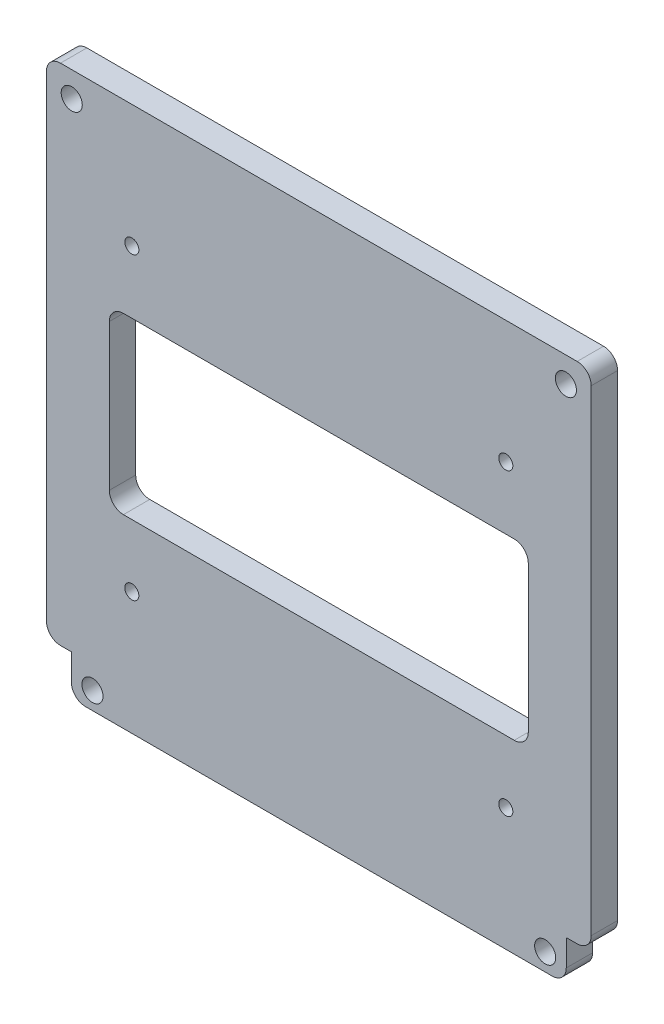
ISO-10303-21;
HEADER;
FILE_DESCRIPTION(('STEP AP214'),'2;1');
FILE_NAME('part.step','',(''),(''),'','','');
FILE_SCHEMA(('AUTOMOTIVE_DESIGN { 1 0 10303 214 1 1 1 1 }'));
ENDSEC;
DATA;
#1=APPLICATION_CONTEXT('core data for automotive mechanical design processes');
#2=APPLICATION_PROTOCOL_DEFINITION('international standard','automotive_design',2000,#1);
#3=PRODUCT_CONTEXT('',#1,'mechanical');
#4=PRODUCT('Part','Part','',(#3));
#5=PRODUCT_RELATED_PRODUCT_CATEGORY('part','',(#4));
#6=PRODUCT_DEFINITION_FORMATION('','',#4);
#7=PRODUCT_DEFINITION_CONTEXT('part definition',#1,'design');
#8=PRODUCT_DEFINITION('design','',#6,#7);
#9=PRODUCT_DEFINITION_SHAPE('','',#8);
#10=(LENGTH_UNIT() NAMED_UNIT(*) SI_UNIT(.MILLI.,.METRE.));
#11=(NAMED_UNIT(*) PLANE_ANGLE_UNIT() SI_UNIT($,.RADIAN.));
#12=(NAMED_UNIT(*) SI_UNIT($,.STERADIAN.) SOLID_ANGLE_UNIT());
#13=UNCERTAINTY_MEASURE_WITH_UNIT(LENGTH_MEASURE(1.E-05),#10,'distance_accuracy_value','');
#14=(GEOMETRIC_REPRESENTATION_CONTEXT(3) GLOBAL_UNCERTAINTY_ASSIGNED_CONTEXT((#13)) GLOBAL_UNIT_ASSIGNED_CONTEXT((#10,
#11,#12)) REPRESENTATION_CONTEXT('',''));
#15=CARTESIAN_POINT('',(0.,0.,0.));
#16=DIRECTION('',(0.,0.,1.));
#17=DIRECTION('',(1.,0.,0.));
#18=AXIS2_PLACEMENT_3D('',#15,#16,#17);
#19=CARTESIAN_POINT('',(10.6529359953024,78.0317307692308,4.7625));
#20=DIRECTION('',(-1.,0.,0.));
#21=DIRECTION('',(0.,-1.,0.));
#22=AXIS2_PLACEMENT_3D('',#19,#20,#21);
#23=PLANE('',#22);
#24=DIRECTION('',(0.,1.,0.));
#25=VECTOR('',#24,1.);
#26=CARTESIAN_POINT('',(10.6529359953024,78.0317307692308,4.7625));
#27=LINE('',#26,#25);
#28=CARTESIAN_POINT('',(10.6529359953024,-10.5507692307691,4.7625));
#29=VERTEX_POINT('',#28);
#30=CARTESIAN_POINT('',(10.6529359953024,75.4917307692308,4.7625));
#31=VERTEX_POINT('',#30);
#32=EDGE_CURVE('E306',#29,#31,#27,.T.);
#33=ORIENTED_EDGE('',*,*,#32,.F.);
#34=DIRECTION('',(0.,0.,-1.));
#35=VECTOR('',#34,1.);
#36=CARTESIAN_POINT('',(10.6529359953024,-10.5507692307691,4.7625));
#37=LINE('',#36,#35);
#38=CARTESIAN_POINT('',(10.6529359953024,-10.5507692307691,0.));
#39=VERTEX_POINT('',#38);
#40=EDGE_CURVE('E45',#29,#39,#37,.T.);
#41=ORIENTED_EDGE('',*,*,#40,.T.);
#42=DIRECTION('',(0.,1.,0.));
#43=VECTOR('',#42,1.);
#44=CARTESIAN_POINT('',(10.6529359953024,78.0317307692308,0.));
#45=LINE('',#44,#43);
#46=CARTESIAN_POINT('',(10.6529359953024,75.4917307692308,0.));
#47=VERTEX_POINT('',#46);
#48=EDGE_CURVE('E303',#39,#47,#45,.T.);
#49=ORIENTED_EDGE('',*,*,#48,.T.);
#50=DIRECTION('',(0.,0.,-1.));
#51=VECTOR('',#50,1.);
#52=CARTESIAN_POINT('',(10.6529359953024,75.4917307692308,4.7625));
#53=LINE('',#52,#51);
#54=EDGE_CURVE('E326',#47,#31,#53,.F.);
#55=ORIENTED_EDGE('',*,*,#54,.T.);
#56=EDGE_LOOP('',(#33,#41,#49,#55));
#57=FACE_BOUND('',#56,.T.);
#58=ADVANCED_FACE('F37',(#57),#23,.F.);
#59=CARTESIAN_POINT('',(-87.7720640046976,78.0317307692308,4.7625));
#60=DIRECTION('',(0.,-1.,0.));
#61=DIRECTION('',(0.,0.,-1.));
#62=AXIS2_PLACEMENT_3D('',#59,#60,#61);
#63=PLANE('',#62);
#64=DIRECTION('',(-1.,0.,0.));
#65=VECTOR('',#64,1.);
#66=CARTESIAN_POINT('',(-87.7720640046976,78.0317307692308,0.));
#67=LINE('',#66,#65);
#68=CARTESIAN_POINT('',(8.11293599530241,78.0317307692308,0.));
#69=VERTEX_POINT('',#68);
#70=CARTESIAN_POINT('',(-85.2320640046976,78.0317307692308,0.));
#71=VERTEX_POINT('',#70);
#72=EDGE_CURVE('E367',#69,#71,#67,.T.);
#73=ORIENTED_EDGE('',*,*,#72,.T.);
#74=DIRECTION('',(0.,0.,-1.));
#75=VECTOR('',#74,1.);
#76=CARTESIAN_POINT('',(-85.2320640046976,78.0317307692308,4.7625));
#77=LINE('',#76,#75);
#78=CARTESIAN_POINT('',(-85.2320640046976,78.0317307692308,4.7625));
#79=VERTEX_POINT('',#78);
#80=EDGE_CURVE('E322',#71,#79,#77,.F.);
#81=ORIENTED_EDGE('',*,*,#80,.T.);
#82=DIRECTION('',(-1.,0.,0.));
#83=VECTOR('',#82,1.);
#84=CARTESIAN_POINT('',(-87.7720640046976,78.0317307692308,4.7625));
#85=LINE('',#84,#83);
#86=CARTESIAN_POINT('',(8.11293599530241,78.0317307692308,4.7625));
#87=VERTEX_POINT('',#86);
#88=EDGE_CURVE('E309',#87,#79,#85,.T.);
#89=ORIENTED_EDGE('',*,*,#88,.F.);
#90=DIRECTION('',(0.,0.,-1.));
#91=VECTOR('',#90,1.);
#92=CARTESIAN_POINT('',(8.11293599530241,78.0317307692308,4.7625));
#93=LINE('',#92,#91);
#94=EDGE_CURVE('E382',#87,#69,#93,.T.);
#95=ORIENTED_EDGE('',*,*,#94,.T.);
#96=EDGE_LOOP('',(#73,#81,#89,#95));
#97=FACE_BOUND('',#96,.T.);
#98=ADVANCED_FACE('F386',(#97),#63,.F.);
#99=CARTESIAN_POINT('',(-87.7720640046976,78.0317307692308,4.7625));
#100=DIRECTION('',(1.,0.,0.));
#101=DIRECTION('',(0.,1.,0.));
#102=AXIS2_PLACEMENT_3D('',#99,#100,#101);
#103=PLANE('',#102);
#104=DIRECTION('',(0.,-1.,0.));
#105=VECTOR('',#104,1.);
#106=CARTESIAN_POINT('',(-87.7720640046976,78.0317307692308,0.));
#107=LINE('',#106,#105);
#108=CARTESIAN_POINT('',(-87.7720640046976,75.4917307692308,0.));
#109=VERTEX_POINT('',#108);
#110=CARTESIAN_POINT('',(-87.7720640046976,-10.5507692307691,0.));
#111=VERTEX_POINT('',#110);
#112=EDGE_CURVE('E369',#109,#111,#107,.T.);
#113=ORIENTED_EDGE('',*,*,#112,.T.);
#114=DIRECTION('',(0.,0.,-1.));
#115=VECTOR('',#114,1.);
#116=CARTESIAN_POINT('',(-87.7720640046976,-10.5507692307691,4.7625));
#117=LINE('',#116,#115);
#118=CARTESIAN_POINT('',(-87.7720640046976,-10.5507692307691,4.7625));
#119=VERTEX_POINT('',#118);
#120=EDGE_CURVE('E348',#111,#119,#117,.F.);
#121=ORIENTED_EDGE('',*,*,#120,.T.);
#122=DIRECTION('',(0.,-1.,0.));
#123=VECTOR('',#122,1.);
#124=CARTESIAN_POINT('',(-87.7720640046976,78.0317307692308,4.7625));
#125=LINE('',#124,#123);
#126=CARTESIAN_POINT('',(-87.7720640046976,75.4917307692308,4.7625));
#127=VERTEX_POINT('',#126);
#128=EDGE_CURVE('E330',#127,#119,#125,.T.);
#129=ORIENTED_EDGE('',*,*,#128,.F.);
#130=DIRECTION('',(0.,0.,-1.));
#131=VECTOR('',#130,1.);
#132=CARTESIAN_POINT('',(-87.7720640046976,75.4917307692308,4.7625));
#133=LINE('',#132,#131);
#134=EDGE_CURVE('E337',#127,#109,#133,.T.);
#135=ORIENTED_EDGE('',*,*,#134,.T.);
#136=EDGE_LOOP('',(#113,#121,#129,#135));
#137=FACE_BOUND('',#136,.T.);
#138=ADVANCED_FACE('F395',(#137),#103,.F.);
#139=CARTESIAN_POINT('',(-87.7720640046976,-20.3932692307692,4.7625));
#140=DIRECTION('',(0.,1.,0.));
#141=DIRECTION('',(0.,0.,1.));
#142=AXIS2_PLACEMENT_3D('',#139,#140,#141);
#143=PLANE('',#142);
#144=DIRECTION('',(1.,0.,0.));
#145=VECTOR('',#144,1.);
#146=CARTESIAN_POINT('',(-87.7720640046976,-20.3932692307692,4.7625));
#147=LINE('',#146,#145);
#148=CARTESIAN_POINT('',(-80.7235640046976,-20.3932692307692,4.7625));
#149=VERTEX_POINT('',#148);
#150=CARTESIAN_POINT('',(3.60443599530243,-20.3932692307692,4.7625));
#151=VERTEX_POINT('',#150);
#152=EDGE_CURVE('E333',#149,#151,#147,.T.);
#153=ORIENTED_EDGE('',*,*,#152,.F.);
#154=DIRECTION('',(0.,0.,-1.));
#155=VECTOR('',#154,1.);
#156=CARTESIAN_POINT('',(-80.7235640046976,-20.3932692307692,4.7625));
#157=LINE('',#156,#155);
#158=CARTESIAN_POINT('',(-80.7235640046976,-20.3932692307692,0.));
#159=VERTEX_POINT('',#158);
#160=EDGE_CURVE('E426',#149,#159,#157,.T.);
#161=ORIENTED_EDGE('',*,*,#160,.T.);
#162=DIRECTION('',(1.,0.,0.));
#163=VECTOR('',#162,1.);
#164=CARTESIAN_POINT('',(-87.7720640046976,-20.3932692307692,0.));
#165=LINE('',#164,#163);
#166=CARTESIAN_POINT('',(3.60443599530243,-20.3932692307692,0.));
#167=VERTEX_POINT('',#166);
#168=EDGE_CURVE('E310',#159,#167,#165,.T.);
#169=ORIENTED_EDGE('',*,*,#168,.T.);
#170=DIRECTION('',(0.,0.,-1.));
#171=VECTOR('',#170,1.);
#172=CARTESIAN_POINT('',(3.60443599530243,-20.3932692307692,4.7625));
#173=LINE('',#172,#171);
#174=EDGE_CURVE('E421',#167,#151,#173,.F.);
#175=ORIENTED_EDGE('',*,*,#174,.T.);
#176=EDGE_LOOP('',(#153,#161,#169,#175));
#177=FACE_BOUND('',#176,.T.);
#178=ADVANCED_FACE('F424',(#177),#143,.F.);
#179=CARTESIAN_POINT('',(0.,0.,4.7625));
#180=DIRECTION('',(0.,0.,1.));
#181=DIRECTION('',(1.,0.,0.));
#182=AXIS2_PLACEMENT_3D('',#179,#180,#181);
#183=PLANE('',#182);
#184=DIRECTION('',(0.,-1.,0.));
#185=VECTOR('',#184,1.);
#186=CARTESIAN_POINT('',(-83.2635640046976,-13.0907692307691,4.7625));
#187=LINE('',#186,#185);
#188=CARTESIAN_POINT('',(-83.2635640046976,-13.0907692307691,4.7625));
#189=VERTEX_POINT('',#188);
#190=CARTESIAN_POINT('',(-83.2635640046976,-17.8532692307692,4.7625));
#191=VERTEX_POINT('',#190);
#192=EDGE_CURVE('E189',#189,#191,#187,.T.);
#193=ORIENTED_EDGE('',*,*,#192,.T.);
#194=CARTESIAN_POINT('',(-80.7235640046976,-17.8532692307692,4.7625));
#195=DIRECTION('',(0.,0.,1.));
#196=DIRECTION('',(1.,0.,0.));
#197=AXIS2_PLACEMENT_3D('',#194,#195,#196);
#198=CIRCLE('',#197,2.54);
#199=EDGE_CURVE('E342',#191,#149,#198,.T.);
#200=ORIENTED_EDGE('',*,*,#199,.T.);
#201=ORIENTED_EDGE('',*,*,#152,.T.);
#202=CARTESIAN_POINT('',(3.60443599530243,-17.8532692307692,4.7625));
#203=DIRECTION('',(0.,0.,1.));
#204=DIRECTION('',(1.,0.,0.));
#205=AXIS2_PLACEMENT_3D('',#202,#203,#204);
#206=CIRCLE('',#205,2.54);
#207=CARTESIAN_POINT('',(6.14443599530243,-17.8532692307692,4.7625));
#208=VERTEX_POINT('',#207);
#209=EDGE_CURVE('E407',#151,#208,#206,.T.);
#210=ORIENTED_EDGE('',*,*,#209,.T.);
#211=DIRECTION('',(0.,1.,0.));
#212=VECTOR('',#211,1.);
#213=CARTESIAN_POINT('',(6.14443599530243,-13.0907692307691,4.7625));
#214=LINE('',#213,#212);
#215=CARTESIAN_POINT('',(6.14443599530243,-13.0907692307691,4.7625));
#216=VERTEX_POINT('',#215);
#217=EDGE_CURVE('E212',#208,#216,#214,.T.);
#218=ORIENTED_EDGE('',*,*,#217,.T.);
#219=DIRECTION('',(1.,0.,0.));
#220=VECTOR('',#219,1.);
#221=CARTESIAN_POINT('',(6.14443599530243,-13.0907692307691,4.7625));
#222=LINE('',#221,#220);
#223=CARTESIAN_POINT('',(8.11293599530243,-13.0907692307691,4.7625));
#224=VERTEX_POINT('',#223);
#225=EDGE_CURVE('E230',#216,#224,#222,.T.);
#226=ORIENTED_EDGE('',*,*,#225,.T.);
#227=CARTESIAN_POINT('',(8.11293599530243,-10.5507692307691,4.7625));
#228=DIRECTION('',(0.,0.,1.));
#229=DIRECTION('',(1.,0.,0.));
#230=AXIS2_PLACEMENT_3D('',#227,#228,#229);
#231=CIRCLE('',#230,2.54);
#232=EDGE_CURVE('E52',#224,#29,#231,.T.);
#233=ORIENTED_EDGE('',*,*,#232,.T.);
#234=ORIENTED_EDGE('',*,*,#32,.T.);
#235=CARTESIAN_POINT('',(8.11293599530241,75.4917307692308,4.7625));
#236=DIRECTION('',(0.,0.,1.));
#237=DIRECTION('',(1.,0.,0.));
#238=AXIS2_PLACEMENT_3D('',#235,#236,#237);
#239=CIRCLE('',#238,2.54);
#240=EDGE_CURVE('E317',#31,#87,#239,.T.);
#241=ORIENTED_EDGE('',*,*,#240,.T.);
#242=ORIENTED_EDGE('',*,*,#88,.T.);
#243=CARTESIAN_POINT('',(-85.2320640046976,75.4917307692308,4.7625));
#244=DIRECTION('',(0.,0.,1.));
#245=DIRECTION('',(1.,0.,0.));
#246=AXIS2_PLACEMENT_3D('',#243,#244,#245);
#247=CIRCLE('',#246,2.54);
#248=EDGE_CURVE('E321',#79,#127,#247,.T.);
#249=ORIENTED_EDGE('',*,*,#248,.T.);
#250=ORIENTED_EDGE('',*,*,#128,.T.);
#251=CARTESIAN_POINT('',(-85.2320640046976,-10.5507692307691,4.7625));
#252=DIRECTION('',(0.,0.,1.));
#253=DIRECTION('',(1.,0.,0.));
#254=AXIS2_PLACEMENT_3D('',#251,#252,#253);
#255=CIRCLE('',#254,2.54);
#256=CARTESIAN_POINT('',(-85.2320640046976,-13.0907692307691,4.7625));
#257=VERTEX_POINT('',#256);
#258=EDGE_CURVE('E193',#119,#257,#255,.T.);
#259=ORIENTED_EDGE('',*,*,#258,.T.);
#260=DIRECTION('',(1.,0.,0.));
#261=VECTOR('',#260,1.);
#262=CARTESIAN_POINT('',(-83.2635640046976,-13.0907692307691,4.7625));
#263=LINE('',#262,#261);
#264=EDGE_CURVE('E185',#257,#189,#263,.T.);
#265=ORIENTED_EDGE('',*,*,#264,.T.);
#266=EDGE_LOOP('',(#193,#200,#201,#210,#218,#226,#233,#234,#241,#242,#249,#250,#259,#265));
#267=FACE_BOUND('',#266,.T.);
#268=CARTESIAN_POINT('',(-79.4535640046976,-17.2182692307692,4.7625));
#269=DIRECTION('',(0.,0.,1.));
#270=DIRECTION('',(1.,0.,0.));
#271=AXIS2_PLACEMENT_3D('',#268,#269,#270);
#272=CIRCLE('',#271,1.90500000000001);
#273=CARTESIAN_POINT('',(-77.5485640046976,-17.2182692307692,4.7625));
#274=VERTEX_POINT('',#273);
#275=EDGE_CURVE('E234',#274,#274,#272,.F.);
#276=ORIENTED_EDGE('',*,*,#275,.T.);
#277=EDGE_LOOP('',(#276));
#278=FACE_BOUND('',#277,.T.);
#279=CARTESIAN_POINT('',(2.33443599530243,-17.2182692307692,4.7625));
#280=DIRECTION('',(0.,0.,1.));
#281=DIRECTION('',(1.,0.,0.));
#282=AXIS2_PLACEMENT_3D('',#279,#280,#281);
#283=CIRCLE('',#282,1.905);
#284=CARTESIAN_POINT('',(4.23943599530243,-17.2182692307692,4.7625));
#285=VERTEX_POINT('',#284);
#286=EDGE_CURVE('E252',#285,#285,#283,.F.);
#287=ORIENTED_EDGE('',*,*,#286,.T.);
#288=EDGE_LOOP('',(#287));
#289=FACE_BOUND('',#288,.T.);
#290=CARTESIAN_POINT('',(-83.2000640046976,73.4597307692308,4.7625));
#291=DIRECTION('',(0.,0.,1.));
#292=DIRECTION('',(1.,0.,0.));
#293=AXIS2_PLACEMENT_3D('',#290,#291,#292);
#294=CIRCLE('',#293,1.90500000000001);
#295=CARTESIAN_POINT('',(-81.2950640046976,73.4597307692308,4.7625));
#296=VERTEX_POINT('',#295);
#297=EDGE_CURVE('E246',#296,#296,#294,.F.);
#298=ORIENTED_EDGE('',*,*,#297,.T.);
#299=EDGE_LOOP('',(#298));
#300=FACE_BOUND('',#299,.T.);
#301=CARTESIAN_POINT('',(6.08093599530243,73.4597307692308,4.7625));
#302=DIRECTION('',(0.,0.,1.));
#303=DIRECTION('',(1.,0.,0.));
#304=AXIS2_PLACEMENT_3D('',#301,#302,#303);
#305=CIRCLE('',#304,1.90500000000001);
#306=CARTESIAN_POINT('',(7.98593599530244,73.4597307692308,4.7625));
#307=VERTEX_POINT('',#306);
#308=EDGE_CURVE('E240',#307,#307,#305,.F.);
#309=ORIENTED_EDGE('',*,*,#308,.T.);
#310=EDGE_LOOP('',(#309));
#311=FACE_BOUND('',#310,.T.);
#312=CARTESIAN_POINT('',(-4.77756400469762,1.76823076923074,4.7625));
#313=DIRECTION('',(0.,0.,1.));
#314=DIRECTION('',(1.,0.,0.));
#315=AXIS2_PLACEMENT_3D('',#312,#313,#314);
#316=CIRCLE('',#315,1.27);
#317=CARTESIAN_POINT('',(-3.50756400469762,1.76823076923074,4.7625));
#318=VERTEX_POINT('',#317);
#319=EDGE_CURVE('E239',#318,#318,#316,.F.);
#320=ORIENTED_EDGE('',*,*,#319,.T.);
#321=EDGE_LOOP('',(#320));
#322=FACE_BOUND('',#321,.T.);
#323=CARTESIAN_POINT('',(-4.77756400469763,55.8702307692308,4.7625));
#324=DIRECTION('',(0.,0.,1.));
#325=DIRECTION('',(1.,0.,0.));
#326=AXIS2_PLACEMENT_3D('',#323,#324,#325);
#327=CIRCLE('',#326,1.27);
#328=CARTESIAN_POINT('',(-3.50756400469763,55.8702307692308,4.7625));
#329=VERTEX_POINT('',#328);
#330=EDGE_CURVE('E276',#329,#329,#327,.F.);
#331=ORIENTED_EDGE('',*,*,#330,.T.);
#332=EDGE_LOOP('',(#331));
#333=FACE_BOUND('',#332,.T.);
#334=CARTESIAN_POINT('',(-72.3415640046975,1.76823076923074,4.7625));
#335=DIRECTION('',(0.,0.,1.));
#336=DIRECTION('',(1.,0.,0.));
#337=AXIS2_PLACEMENT_3D('',#334,#335,#336);
#338=CIRCLE('',#337,1.26999999999999);
#339=CARTESIAN_POINT('',(-71.0715640046975,1.76823076923074,4.7625));
#340=VERTEX_POINT('',#339);
#341=EDGE_CURVE('E270',#340,#340,#338,.F.);
#342=ORIENTED_EDGE('',*,*,#341,.T.);
#343=EDGE_LOOP('',(#342));
#344=FACE_BOUND('',#343,.T.);
#345=CARTESIAN_POINT('',(-72.3415640046975,55.8702307692308,4.7625));
#346=DIRECTION('',(0.,0.,1.));
#347=DIRECTION('',(1.,0.,0.));
#348=AXIS2_PLACEMENT_3D('',#345,#346,#347);
#349=CIRCLE('',#348,1.26999999999999);
#350=CARTESIAN_POINT('',(-71.0715640046975,55.8702307692308,4.7625));
#351=VERTEX_POINT('',#350);
#352=EDGE_CURVE('E264',#351,#351,#349,.F.);
#353=ORIENTED_EDGE('',*,*,#352,.T.);
#354=EDGE_LOOP('',(#353));
#355=FACE_BOUND('',#354,.T.);
#356=DIRECTION('',(1.,0.,0.));
#357=VECTOR('',#356,1.);
#358=CARTESIAN_POINT('',(-76.4055640046975,44.5672307692307,4.7625));
#359=LINE('',#358,#357);
#360=CARTESIAN_POINT('',(-73.8655640046975,44.5672307692307,4.7625));
#361=VERTEX_POINT('',#360);
#362=CARTESIAN_POINT('',(-3.25356400469763,44.5672307692307,4.7625));
#363=VERTEX_POINT('',#362);
#364=EDGE_CURVE('E286',#361,#363,#359,.T.);
#365=ORIENTED_EDGE('',*,*,#364,.T.);
#366=CARTESIAN_POINT('',(-3.25356400469763,42.0272307692307,4.7625));
#367=DIRECTION('',(0.,0.,1.));
#368=DIRECTION('',(1.,0.,0.));
#369=AXIS2_PLACEMENT_3D('',#366,#367,#368);
#370=CIRCLE('',#369,2.54);
#371=CARTESIAN_POINT('',(-0.713564004697631,42.0272307692307,4.7625));
#372=VERTEX_POINT('',#371);
#373=EDGE_CURVE('E429',#363,#372,#370,.F.);
#374=ORIENTED_EDGE('',*,*,#373,.T.);
#375=DIRECTION('',(0.,-1.,0.));
#376=VECTOR('',#375,1.);
#377=CARTESIAN_POINT('',(-0.713564004697631,13.0712307692308,4.7625));
#378=LINE('',#377,#376);
#379=CARTESIAN_POINT('',(-0.713564004697631,15.6112307692308,4.7625));
#380=VERTEX_POINT('',#379);
#381=EDGE_CURVE('E290',#372,#380,#378,.T.);
#382=ORIENTED_EDGE('',*,*,#381,.T.);
#383=CARTESIAN_POINT('',(-3.25356400469763,15.6112307692308,4.7625));
#384=DIRECTION('',(0.,0.,1.));
#385=DIRECTION('',(1.,0.,0.));
#386=AXIS2_PLACEMENT_3D('',#383,#384,#385);
#387=CIRCLE('',#386,2.54);
#388=CARTESIAN_POINT('',(-3.25356400469763,13.0712307692308,4.7625));
#389=VERTEX_POINT('',#388);
#390=EDGE_CURVE('E435',#380,#389,#387,.F.);
#391=ORIENTED_EDGE('',*,*,#390,.T.);
#392=DIRECTION('',(-1.,0.,0.));
#393=VECTOR('',#392,1.);
#394=CARTESIAN_POINT('',(-76.4055640046975,13.0712307692308,4.7625));
#395=LINE('',#394,#393);
#396=CARTESIAN_POINT('',(-73.8655640046975,13.0712307692308,4.7625));
#397=VERTEX_POINT('',#396);
#398=EDGE_CURVE('E298',#389,#397,#395,.T.);
#399=ORIENTED_EDGE('',*,*,#398,.T.);
#400=CARTESIAN_POINT('',(-73.8655640046975,15.6112307692308,4.7625));
#401=DIRECTION('',(0.,0.,1.));
#402=DIRECTION('',(1.,0.,0.));
#403=AXIS2_PLACEMENT_3D('',#400,#401,#402);
#404=CIRCLE('',#403,2.54);
#405=CARTESIAN_POINT('',(-76.4055640046975,15.6112307692308,4.7625));
#406=VERTEX_POINT('',#405);
#407=EDGE_CURVE('E443',#397,#406,#404,.F.);
#408=ORIENTED_EDGE('',*,*,#407,.T.);
#409=DIRECTION('',(0.,1.,0.));
#410=VECTOR('',#409,1.);
#411=CARTESIAN_POINT('',(-76.4055640046975,13.0712307692308,4.7625));
#412=LINE('',#411,#410);
#413=CARTESIAN_POINT('',(-76.4055640046975,42.0272307692307,4.7625));
#414=VERTEX_POINT('',#413);
#415=EDGE_CURVE('E263',#406,#414,#412,.T.);
#416=ORIENTED_EDGE('',*,*,#415,.T.);
#417=CARTESIAN_POINT('',(-73.8655640046975,42.0272307692307,4.7625));
#418=DIRECTION('',(0.,0.,1.));
#419=DIRECTION('',(1.,0.,0.));
#420=AXIS2_PLACEMENT_3D('',#417,#418,#419);
#421=CIRCLE('',#420,2.54);
#422=EDGE_CURVE('E439',#414,#361,#421,.F.);
#423=ORIENTED_EDGE('',*,*,#422,.T.);
#424=EDGE_LOOP('',(#365,#374,#382,#391,#399,#408,#416,#423));
#425=FACE_BOUND('',#424,.T.);
#426=ADVANCED_FACE('F187',(#267,#278,#289,#300,#311,#322,#333,#344,#355,#425),#183,.T.);
#427=CARTESIAN_POINT('',(0.,0.,0.));
#428=DIRECTION('',(0.,0.,1.));
#429=DIRECTION('',(1.,0.,0.));
#430=AXIS2_PLACEMENT_3D('',#427,#428,#429);
#431=PLANE('',#430);
#432=CARTESIAN_POINT('',(-79.4535640046976,-17.2182692307692,0.));
#433=DIRECTION('',(0.,0.,-1.));
#434=DIRECTION('',(-1.,0.,0.));
#435=AXIS2_PLACEMENT_3D('',#432,#433,#434);
#436=CIRCLE('',#435,1.90500000000001);
#437=CARTESIAN_POINT('',(-81.3585640046976,-17.2182692307692,0.));
#438=VERTEX_POINT('',#437);
#439=EDGE_CURVE('E255',#438,#438,#436,.T.);
#440=ORIENTED_EDGE('',*,*,#439,.F.);
#441=EDGE_LOOP('',(#440));
#442=FACE_BOUND('',#441,.T.);
#443=CARTESIAN_POINT('',(2.33443599530243,-17.2182692307692,0.));
#444=DIRECTION('',(0.,0.,-1.));
#445=DIRECTION('',(-1.,0.,0.));
#446=AXIS2_PLACEMENT_3D('',#443,#444,#445);
#447=CIRCLE('',#446,1.905);
#448=CARTESIAN_POINT('',(0.42943599530243,-17.2182692307692,0.));
#449=VERTEX_POINT('',#448);
#450=EDGE_CURVE('E249',#449,#449,#447,.T.);
#451=ORIENTED_EDGE('',*,*,#450,.F.);
#452=EDGE_LOOP('',(#451));
#453=FACE_BOUND('',#452,.T.);
#454=CARTESIAN_POINT('',(-83.2000640046976,73.4597307692308,0.));
#455=DIRECTION('',(0.,0.,-1.));
#456=DIRECTION('',(1.,0.,0.));
#457=AXIS2_PLACEMENT_3D('',#454,#455,#456);
#458=CIRCLE('',#457,1.90500000000001);
#459=CARTESIAN_POINT('',(-81.2950640046976,73.4597307692308,0.));
#460=VERTEX_POINT('',#459);
#461=EDGE_CURVE('E243',#460,#460,#458,.T.);
#462=ORIENTED_EDGE('',*,*,#461,.F.);
#463=EDGE_LOOP('',(#462));
#464=FACE_BOUND('',#463,.T.);
#465=CARTESIAN_POINT('',(6.08093599530243,73.4597307692308,0.));
#466=DIRECTION('',(0.,0.,-1.));
#467=DIRECTION('',(-1.,0.,0.));
#468=AXIS2_PLACEMENT_3D('',#465,#466,#467);
#469=CIRCLE('',#468,1.90500000000001);
#470=CARTESIAN_POINT('',(4.17593599530243,73.4597307692308,0.));
#471=VERTEX_POINT('',#470);
#472=EDGE_CURVE('E236',#471,#471,#469,.T.);
#473=ORIENTED_EDGE('',*,*,#472,.F.);
#474=EDGE_LOOP('',(#473));
#475=FACE_BOUND('',#474,.T.);
#476=CARTESIAN_POINT('',(-4.77756400469762,1.76823076923074,0.));
#477=DIRECTION('',(0.,0.,-1.));
#478=DIRECTION('',(1.,0.,0.));
#479=AXIS2_PLACEMENT_3D('',#476,#477,#478);
#480=CIRCLE('',#479,1.27);
#481=CARTESIAN_POINT('',(-3.50756400469762,1.76823076923074,0.));
#482=VERTEX_POINT('',#481);
#483=EDGE_CURVE('E279',#482,#482,#480,.T.);
#484=ORIENTED_EDGE('',*,*,#483,.F.);
#485=EDGE_LOOP('',(#484));
#486=FACE_BOUND('',#485,.T.);
#487=CARTESIAN_POINT('',(-4.77756400469763,55.8702307692308,0.));
#488=DIRECTION('',(0.,0.,-1.));
#489=DIRECTION('',(-1.,0.,0.));
#490=AXIS2_PLACEMENT_3D('',#487,#488,#489);
#491=CIRCLE('',#490,1.27);
#492=CARTESIAN_POINT('',(-6.04756400469763,55.8702307692308,0.));
#493=VERTEX_POINT('',#492);
#494=EDGE_CURVE('E273',#493,#493,#491,.T.);
#495=ORIENTED_EDGE('',*,*,#494,.F.);
#496=EDGE_LOOP('',(#495));
#497=FACE_BOUND('',#496,.T.);
#498=CARTESIAN_POINT('',(-72.3415640046975,1.76823076923074,0.));
#499=DIRECTION('',(0.,0.,-1.));
#500=DIRECTION('',(-1.,0.,0.));
#501=AXIS2_PLACEMENT_3D('',#498,#499,#500);
#502=CIRCLE('',#501,1.26999999999999);
#503=CARTESIAN_POINT('',(-73.6115640046975,1.76823076923074,0.));
#504=VERTEX_POINT('',#503);
#505=EDGE_CURVE('E267',#504,#504,#502,.T.);
#506=ORIENTED_EDGE('',*,*,#505,.F.);
#507=EDGE_LOOP('',(#506));
#508=FACE_BOUND('',#507,.T.);
#509=CARTESIAN_POINT('',(-72.3415640046975,55.8702307692308,0.));
#510=DIRECTION('',(0.,0.,-1.));
#511=DIRECTION('',(1.,0.,0.));
#512=AXIS2_PLACEMENT_3D('',#509,#510,#511);
#513=CIRCLE('',#512,1.26999999999999);
#514=CARTESIAN_POINT('',(-71.0715640046975,55.8702307692308,0.));
#515=VERTEX_POINT('',#514);
#516=EDGE_CURVE('E260',#515,#515,#513,.T.);
#517=ORIENTED_EDGE('',*,*,#516,.F.);
#518=EDGE_LOOP('',(#517));
#519=FACE_BOUND('',#518,.T.);
#520=DIRECTION('',(-1.,0.,0.));
#521=VECTOR('',#520,1.);
#522=CARTESIAN_POINT('',(-76.4055640046975,13.0712307692308,0.));
#523=LINE('',#522,#521);
#524=CARTESIAN_POINT('',(-3.25356400469763,13.0712307692308,0.));
#525=VERTEX_POINT('',#524);
#526=CARTESIAN_POINT('',(-73.8655640046975,13.0712307692308,0.));
#527=VERTEX_POINT('',#526);
#528=EDGE_CURVE('E838',#525,#527,#523,.T.);
#529=ORIENTED_EDGE('',*,*,#528,.F.);
#530=CARTESIAN_POINT('',(-3.25356400469763,15.6112307692308,0.));
#531=DIRECTION('',(0.,0.,1.));
#532=DIRECTION('',(1.,0.,0.));
#533=AXIS2_PLACEMENT_3D('',#530,#531,#532);
#534=CIRCLE('',#533,2.54);
#535=CARTESIAN_POINT('',(-0.713564004697631,15.6112307692308,0.));
#536=VERTEX_POINT('',#535);
#537=EDGE_CURVE('E437',#525,#536,#534,.T.);
#538=ORIENTED_EDGE('',*,*,#537,.T.);
#539=DIRECTION('',(0.,-1.,0.));
#540=VECTOR('',#539,1.);
#541=CARTESIAN_POINT('',(-0.713564004697631,13.0712307692308,0.));
#542=LINE('',#541,#540);
#543=CARTESIAN_POINT('',(-0.713564004697631,42.0272307692307,0.));
#544=VERTEX_POINT('',#543);
#545=EDGE_CURVE('E837',#544,#536,#542,.T.);
#546=ORIENTED_EDGE('',*,*,#545,.F.);
#547=CARTESIAN_POINT('',(-3.25356400469763,42.0272307692307,0.));
#548=DIRECTION('',(0.,0.,1.));
#549=DIRECTION('',(1.,0.,0.));
#550=AXIS2_PLACEMENT_3D('',#547,#548,#549);
#551=CIRCLE('',#550,2.54);
#552=CARTESIAN_POINT('',(-3.25356400469763,44.5672307692307,0.));
#553=VERTEX_POINT('',#552);
#554=EDGE_CURVE('E433',#544,#553,#551,.T.);
#555=ORIENTED_EDGE('',*,*,#554,.T.);
#556=DIRECTION('',(1.,0.,0.));
#557=VECTOR('',#556,1.);
#558=CARTESIAN_POINT('',(-76.4055640046975,44.5672307692307,0.));
#559=LINE('',#558,#557);
#560=CARTESIAN_POINT('',(-73.8655640046975,44.5672307692307,0.));
#561=VERTEX_POINT('',#560);
#562=EDGE_CURVE('E304',#561,#553,#559,.T.);
#563=ORIENTED_EDGE('',*,*,#562,.F.);
#564=CARTESIAN_POINT('',(-73.8655640046975,42.0272307692307,0.));
#565=DIRECTION('',(0.,0.,1.));
#566=DIRECTION('',(1.,0.,0.));
#567=AXIS2_PLACEMENT_3D('',#564,#565,#566);
#568=CIRCLE('',#567,2.54);
#569=CARTESIAN_POINT('',(-76.4055640046975,42.0272307692307,0.));
#570=VERTEX_POINT('',#569);
#571=EDGE_CURVE('E441',#561,#570,#568,.T.);
#572=ORIENTED_EDGE('',*,*,#571,.T.);
#573=DIRECTION('',(0.,1.,0.));
#574=VECTOR('',#573,1.);
#575=CARTESIAN_POINT('',(-76.4055640046975,13.0712307692308,0.));
#576=LINE('',#575,#574);
#577=CARTESIAN_POINT('',(-76.4055640046975,15.6112307692308,0.));
#578=VERTEX_POINT('',#577);
#579=EDGE_CURVE('E840',#578,#570,#576,.T.);
#580=ORIENTED_EDGE('',*,*,#579,.F.);
#581=CARTESIAN_POINT('',(-73.8655640046975,15.6112307692308,0.));
#582=DIRECTION('',(0.,0.,1.));
#583=DIRECTION('',(1.,0.,0.));
#584=AXIS2_PLACEMENT_3D('',#581,#582,#583);
#585=CIRCLE('',#584,2.54);
#586=EDGE_CURVE('E445',#578,#527,#585,.T.);
#587=ORIENTED_EDGE('',*,*,#586,.T.);
#588=EDGE_LOOP('',(#529,#538,#546,#555,#563,#572,#580,#587));
#589=FACE_BOUND('',#588,.T.);
#590=ORIENTED_EDGE('',*,*,#168,.F.);
#591=CARTESIAN_POINT('',(-80.7235640046976,-17.8532692307692,0.));
#592=DIRECTION('',(0.,0.,1.));
#593=DIRECTION('',(1.,0.,0.));
#594=AXIS2_PLACEMENT_3D('',#591,#592,#593);
#595=CIRCLE('',#594,2.54);
#596=CARTESIAN_POINT('',(-83.2635640046976,-17.8532692307692,0.));
#597=VERTEX_POINT('',#596);
#598=EDGE_CURVE('E399',#159,#597,#595,.F.);
#599=ORIENTED_EDGE('',*,*,#598,.T.);
#600=DIRECTION('',(0.,-1.,0.));
#601=VECTOR('',#600,1.);
#602=CARTESIAN_POINT('',(-83.2635640046976,-13.0907692307691,0.));
#603=LINE('',#602,#601);
#604=CARTESIAN_POINT('',(-83.2635640046976,-13.0907692307691,0.));
#605=VERTEX_POINT('',#604);
#606=EDGE_CURVE('E207',#605,#597,#603,.T.);
#607=ORIENTED_EDGE('',*,*,#606,.F.);
#608=DIRECTION('',(1.,0.,0.));
#609=VECTOR('',#608,1.);
#610=CARTESIAN_POINT('',(-83.2635640046976,-13.0907692307691,0.));
#611=LINE('',#610,#609);
#612=CARTESIAN_POINT('',(-85.2320640046976,-13.0907692307691,0.));
#613=VERTEX_POINT('',#612);
#614=EDGE_CURVE('E211',#613,#605,#611,.T.);
#615=ORIENTED_EDGE('',*,*,#614,.F.);
#616=CARTESIAN_POINT('',(-85.2320640046976,-10.5507692307691,0.));
#617=DIRECTION('',(0.,0.,1.));
#618=DIRECTION('',(1.,0.,0.));
#619=AXIS2_PLACEMENT_3D('',#616,#617,#618);
#620=CIRCLE('',#619,2.54);
#621=EDGE_CURVE('E397',#613,#111,#620,.F.);
#622=ORIENTED_EDGE('',*,*,#621,.T.);
#623=ORIENTED_EDGE('',*,*,#112,.F.);
#624=CARTESIAN_POINT('',(-85.2320640046976,75.4917307692308,0.));
#625=DIRECTION('',(0.,0.,1.));
#626=DIRECTION('',(1.,0.,0.));
#627=AXIS2_PLACEMENT_3D('',#624,#625,#626);
#628=CIRCLE('',#627,2.54);
#629=EDGE_CURVE('E381',#109,#71,#628,.F.);
#630=ORIENTED_EDGE('',*,*,#629,.T.);
#631=ORIENTED_EDGE('',*,*,#72,.F.);
#632=CARTESIAN_POINT('',(8.11293599530241,75.4917307692308,0.));
#633=DIRECTION('',(0.,0.,1.));
#634=DIRECTION('',(1.,0.,0.));
#635=AXIS2_PLACEMENT_3D('',#632,#633,#634);
#636=CIRCLE('',#635,2.54);
#637=EDGE_CURVE('E365',#69,#47,#636,.F.);
#638=ORIENTED_EDGE('',*,*,#637,.T.);
#639=ORIENTED_EDGE('',*,*,#48,.F.);
#640=CARTESIAN_POINT('',(8.11293599530243,-10.5507692307691,0.));
#641=DIRECTION('',(0.,0.,1.));
#642=DIRECTION('',(1.,0.,0.));
#643=AXIS2_PLACEMENT_3D('',#640,#641,#642);
#644=CIRCLE('',#643,2.54);
#645=CARTESIAN_POINT('',(8.11293599530243,-13.0907692307691,0.));
#646=VERTEX_POINT('',#645);
#647=EDGE_CURVE('E363',#39,#646,#644,.F.);
#648=ORIENTED_EDGE('',*,*,#647,.T.);
#649=DIRECTION('',(1.,0.,0.));
#650=VECTOR('',#649,1.);
#651=CARTESIAN_POINT('',(6.14443599530243,-13.0907692307691,0.));
#652=LINE('',#651,#650);
#653=CARTESIAN_POINT('',(6.14443599530243,-13.0907692307691,0.));
#654=VERTEX_POINT('',#653);
#655=EDGE_CURVE('E854',#654,#646,#652,.T.);
#656=ORIENTED_EDGE('',*,*,#655,.F.);
#657=DIRECTION('',(0.,1.,0.));
#658=VECTOR('',#657,1.);
#659=CARTESIAN_POINT('',(6.14443599530243,-13.0907692307691,0.));
#660=LINE('',#659,#658);
#661=CARTESIAN_POINT('',(6.14443599530243,-17.8532692307692,0.));
#662=VERTEX_POINT('',#661);
#663=EDGE_CURVE('E214',#662,#654,#660,.T.);
#664=ORIENTED_EDGE('',*,*,#663,.F.);
#665=CARTESIAN_POINT('',(3.60443599530243,-17.8532692307692,0.));
#666=DIRECTION('',(0.,0.,1.));
#667=DIRECTION('',(1.,0.,0.));
#668=AXIS2_PLACEMENT_3D('',#665,#666,#667);
#669=CIRCLE('',#668,2.54);
#670=EDGE_CURVE('E400',#662,#167,#669,.F.);
#671=ORIENTED_EDGE('',*,*,#670,.T.);
#672=EDGE_LOOP('',(#590,#599,#607,#615,#622,#623,#630,#631,#638,#639,#648,#656,#664,#671));
#673=FACE_BOUND('',#672,.T.);
#674=ADVANCED_FACE('F361',(#442,#453,#464,#475,#486,#497,#508,#519,#589,#673),#431,.F.);
#675=CARTESIAN_POINT('',(-0.713564004697631,13.0712307692308,4.7635));
#676=DIRECTION('',(1.,0.,0.));
#677=DIRECTION('',(0.,0.,-1.));
#678=AXIS2_PLACEMENT_3D('',#675,#676,#677);
#679=PLANE('',#678);
#680=ORIENTED_EDGE('',*,*,#545,.T.);
#681=DIRECTION('',(0.,0.,-1.));
#682=VECTOR('',#681,1.);
#683=CARTESIAN_POINT('',(-0.713564004697631,15.6112307692308,4.7625));
#684=LINE('',#683,#682);
#685=EDGE_CURVE('E447',#536,#380,#684,.F.);
#686=ORIENTED_EDGE('',*,*,#685,.T.);
#687=ORIENTED_EDGE('',*,*,#381,.F.);
#688=DIRECTION('',(0.,0.,-1.));
#689=VECTOR('',#688,1.);
#690=CARTESIAN_POINT('',(-0.713564004697631,42.0272307692307,0.));
#691=LINE('',#690,#689);
#692=EDGE_CURVE('E449',#372,#544,#691,.T.);
#693=ORIENTED_EDGE('',*,*,#692,.T.);
#694=EDGE_LOOP('',(#680,#686,#687,#693));
#695=FACE_BOUND('',#694,.T.);
#696=ADVANCED_FACE('F495',(#695),#679,.F.);
#697=CARTESIAN_POINT('',(-76.4055640046975,44.5672307692307,4.7635));
#698=DIRECTION('',(0.,1.,0.));
#699=DIRECTION('',(0.,0.,1.));
#700=AXIS2_PLACEMENT_3D('',#697,#698,#699);
#701=PLANE('',#700);
#702=ORIENTED_EDGE('',*,*,#364,.F.);
#703=DIRECTION('',(0.,0.,-1.));
#704=VECTOR('',#703,1.);
#705=CARTESIAN_POINT('',(-73.8655640046975,44.5672307692307,0.));
#706=LINE('',#705,#704);
#707=EDGE_CURVE('E452',#361,#561,#706,.T.);
#708=ORIENTED_EDGE('',*,*,#707,.T.);
#709=ORIENTED_EDGE('',*,*,#562,.T.);
#710=DIRECTION('',(0.,0.,-1.));
#711=VECTOR('',#710,1.);
#712=CARTESIAN_POINT('',(-3.25356400469763,44.5672307692307,4.7625));
#713=LINE('',#712,#711);
#714=EDGE_CURVE('E455',#553,#363,#713,.F.);
#715=ORIENTED_EDGE('',*,*,#714,.T.);
#716=EDGE_LOOP('',(#702,#708,#709,#715));
#717=FACE_BOUND('',#716,.T.);
#718=ADVANCED_FACE('F501',(#717),#701,.F.);
#719=CARTESIAN_POINT('',(-76.4055640046975,13.0712307692308,4.7635));
#720=DIRECTION('',(-1.,0.,0.));
#721=DIRECTION('',(0.,0.,1.));
#722=AXIS2_PLACEMENT_3D('',#719,#720,#721);
#723=PLANE('',#722);
#724=ORIENTED_EDGE('',*,*,#415,.F.);
#725=DIRECTION('',(0.,0.,-1.));
#726=VECTOR('',#725,1.);
#727=CARTESIAN_POINT('',(-76.4055640046975,15.6112307692308,0.));
#728=LINE('',#727,#726);
#729=EDGE_CURVE('E462',#406,#578,#728,.T.);
#730=ORIENTED_EDGE('',*,*,#729,.T.);
#731=ORIENTED_EDGE('',*,*,#579,.T.);
#732=DIRECTION('',(0.,0.,-1.));
#733=VECTOR('',#732,1.);
#734=CARTESIAN_POINT('',(-76.4055640046975,42.0272307692307,4.7625));
#735=LINE('',#734,#733);
#736=EDGE_CURVE('E464',#570,#414,#735,.F.);
#737=ORIENTED_EDGE('',*,*,#736,.T.);
#738=EDGE_LOOP('',(#724,#730,#731,#737));
#739=FACE_BOUND('',#738,.T.);
#740=ADVANCED_FACE('F507',(#739),#723,.F.);
#741=CARTESIAN_POINT('',(-76.4055640046975,13.0712307692308,4.7635));
#742=DIRECTION('',(0.,-1.,0.));
#743=DIRECTION('',(0.,0.,-1.));
#744=AXIS2_PLACEMENT_3D('',#741,#742,#743);
#745=PLANE('',#744);
#746=ORIENTED_EDGE('',*,*,#528,.T.);
#747=DIRECTION('',(0.,0.,-1.));
#748=VECTOR('',#747,1.);
#749=CARTESIAN_POINT('',(-73.8655640046975,13.0712307692308,4.7625));
#750=LINE('',#749,#748);
#751=EDGE_CURVE('E457',#527,#397,#750,.F.);
#752=ORIENTED_EDGE('',*,*,#751,.T.);
#753=ORIENTED_EDGE('',*,*,#398,.F.);
#754=DIRECTION('',(0.,0.,-1.));
#755=VECTOR('',#754,1.);
#756=CARTESIAN_POINT('',(-3.25356400469763,13.0712307692308,0.));
#757=LINE('',#756,#755);
#758=EDGE_CURVE('E459',#389,#525,#757,.T.);
#759=ORIENTED_EDGE('',*,*,#758,.T.);
#760=EDGE_LOOP('',(#746,#752,#753,#759));
#761=FACE_BOUND('',#760,.T.);
#762=ADVANCED_FACE('F503',(#761),#745,.F.);
#763=CARTESIAN_POINT('',(-72.3415640046975,55.8702307692308,4.7635));
#764=DIRECTION('',(0.,0.,-1.));
#765=DIRECTION('',(-1.,0.,0.));
#766=AXIS2_PLACEMENT_3D('',#763,#764,#765);
#767=CYLINDRICAL_SURFACE('',#766,1.26999999999999);
#768=ORIENTED_EDGE('',*,*,#352,.F.);
#769=EDGE_LOOP('',(#768));
#770=FACE_BOUND('',#769,.T.);
#771=ORIENTED_EDGE('',*,*,#516,.T.);
#772=EDGE_LOOP('',(#771));
#773=FACE_BOUND('',#772,.T.);
#774=ADVANCED_FACE('F506',(#770,#773),#767,.F.);
#775=CARTESIAN_POINT('',(-72.3415640046975,1.76823076923074,4.7635));
#776=DIRECTION('',(0.,0.,-1.));
#777=DIRECTION('',(-1.,0.,0.));
#778=AXIS2_PLACEMENT_3D('',#775,#776,#777);
#779=CYLINDRICAL_SURFACE('',#778,1.26999999999999);
#780=ORIENTED_EDGE('',*,*,#341,.F.);
#781=EDGE_LOOP('',(#780));
#782=FACE_BOUND('',#781,.T.);
#783=ORIENTED_EDGE('',*,*,#505,.T.);
#784=EDGE_LOOP('',(#783));
#785=FACE_BOUND('',#784,.T.);
#786=ADVANCED_FACE('F522',(#782,#785),#779,.F.);
#787=CARTESIAN_POINT('',(-4.77756400469763,55.8702307692308,4.7635));
#788=DIRECTION('',(0.,0.,-1.));
#789=DIRECTION('',(-1.,0.,0.));
#790=AXIS2_PLACEMENT_3D('',#787,#788,#789);
#791=CYLINDRICAL_SURFACE('',#790,1.27);
#792=ORIENTED_EDGE('',*,*,#330,.F.);
#793=EDGE_LOOP('',(#792));
#794=FACE_BOUND('',#793,.T.);
#795=ORIENTED_EDGE('',*,*,#494,.T.);
#796=EDGE_LOOP('',(#795));
#797=FACE_BOUND('',#796,.T.);
#798=ADVANCED_FACE('F518',(#794,#797),#791,.F.);
#799=CARTESIAN_POINT('',(-4.77756400469762,1.76823076923074,4.7635));
#800=DIRECTION('',(0.,0.,-1.));
#801=DIRECTION('',(-1.,0.,0.));
#802=AXIS2_PLACEMENT_3D('',#799,#800,#801);
#803=CYLINDRICAL_SURFACE('',#802,1.27);
#804=ORIENTED_EDGE('',*,*,#319,.F.);
#805=EDGE_LOOP('',(#804));
#806=FACE_BOUND('',#805,.T.);
#807=ORIENTED_EDGE('',*,*,#483,.T.);
#808=EDGE_LOOP('',(#807));
#809=FACE_BOUND('',#808,.T.);
#810=ADVANCED_FACE('F514',(#806,#809),#803,.F.);
#811=CARTESIAN_POINT('',(6.08093599530243,73.4597307692308,4.7635));
#812=DIRECTION('',(0.,0.,-1.));
#813=DIRECTION('',(-1.,0.,0.));
#814=AXIS2_PLACEMENT_3D('',#811,#812,#813);
#815=CYLINDRICAL_SURFACE('',#814,1.90500000000001);
#816=ORIENTED_EDGE('',*,*,#308,.F.);
#817=EDGE_LOOP('',(#816));
#818=FACE_BOUND('',#817,.T.);
#819=ORIENTED_EDGE('',*,*,#472,.T.);
#820=EDGE_LOOP('',(#819));
#821=FACE_BOUND('',#820,.T.);
#822=ADVANCED_FACE('F517',(#818,#821),#815,.F.);
#823=CARTESIAN_POINT('',(-83.2000640046976,73.4597307692308,4.7635));
#824=DIRECTION('',(0.,0.,-1.));
#825=DIRECTION('',(-1.,0.,0.));
#826=AXIS2_PLACEMENT_3D('',#823,#824,#825);
#827=CYLINDRICAL_SURFACE('',#826,1.90500000000001);
#828=ORIENTED_EDGE('',*,*,#297,.F.);
#829=EDGE_LOOP('',(#828));
#830=FACE_BOUND('',#829,.T.);
#831=ORIENTED_EDGE('',*,*,#461,.T.);
#832=EDGE_LOOP('',(#831));
#833=FACE_BOUND('',#832,.T.);
#834=ADVANCED_FACE('F537',(#830,#833),#827,.F.);
#835=CARTESIAN_POINT('',(2.33443599530243,-17.2182692307692,4.7635));
#836=DIRECTION('',(0.,0.,-1.));
#837=DIRECTION('',(-1.,0.,0.));
#838=AXIS2_PLACEMENT_3D('',#835,#836,#837);
#839=CYLINDRICAL_SURFACE('',#838,1.905);
#840=ORIENTED_EDGE('',*,*,#286,.F.);
#841=EDGE_LOOP('',(#840));
#842=FACE_BOUND('',#841,.T.);
#843=ORIENTED_EDGE('',*,*,#450,.T.);
#844=EDGE_LOOP('',(#843));
#845=FACE_BOUND('',#844,.T.);
#846=ADVANCED_FACE('F533',(#842,#845),#839,.F.);
#847=CARTESIAN_POINT('',(-79.4535640046976,-17.2182692307692,4.7635));
#848=DIRECTION('',(0.,0.,-1.));
#849=DIRECTION('',(-1.,0.,0.));
#850=AXIS2_PLACEMENT_3D('',#847,#848,#849);
#851=CYLINDRICAL_SURFACE('',#850,1.90500000000001);
#852=ORIENTED_EDGE('',*,*,#275,.F.);
#853=EDGE_LOOP('',(#852));
#854=FACE_BOUND('',#853,.T.);
#855=ORIENTED_EDGE('',*,*,#439,.T.);
#856=EDGE_LOOP('',(#855));
#857=FACE_BOUND('',#856,.T.);
#858=ADVANCED_FACE('F530',(#854,#857),#851,.F.);
#859=CARTESIAN_POINT('',(6.14443599530243,-13.0907692307691,4.7635));
#860=DIRECTION('',(-1.,0.,0.));
#861=DIRECTION('',(0.,0.,1.));
#862=AXIS2_PLACEMENT_3D('',#859,#860,#861);
#863=PLANE('',#862);
#864=ORIENTED_EDGE('',*,*,#217,.F.);
#865=DIRECTION('',(0.,0.,-1.));
#866=VECTOR('',#865,1.);
#867=CARTESIAN_POINT('',(6.14443599530243,-17.8532692307692,4.7635));
#868=LINE('',#867,#866);
#869=EDGE_CURVE('E350',#208,#662,#868,.T.);
#870=ORIENTED_EDGE('',*,*,#869,.T.);
#871=ORIENTED_EDGE('',*,*,#663,.T.);
#872=DIRECTION('',(0.,0.,-1.));
#873=VECTOR('',#872,1.);
#874=CARTESIAN_POINT('',(6.14443599530243,-13.0907692307691,4.7635));
#875=LINE('',#874,#873);
#876=EDGE_CURVE('E235',#216,#654,#875,.T.);
#877=ORIENTED_EDGE('',*,*,#876,.F.);
#878=EDGE_LOOP('',(#864,#870,#871,#877));
#879=FACE_BOUND('',#878,.T.);
#880=ADVANCED_FACE('F417',(#879),#863,.F.);
#881=CARTESIAN_POINT('',(6.14443599530243,-13.0907692307691,4.7635));
#882=DIRECTION('',(0.,1.,0.));
#883=DIRECTION('',(0.,0.,1.));
#884=AXIS2_PLACEMENT_3D('',#881,#882,#883);
#885=PLANE('',#884);
#886=ORIENTED_EDGE('',*,*,#655,.T.);
#887=DIRECTION('',(0.,0.,-1.));
#888=VECTOR('',#887,1.);
#889=CARTESIAN_POINT('',(8.11293599530243,-13.0907692307691,4.7635));
#890=LINE('',#889,#888);
#891=EDGE_CURVE('E12',#646,#224,#890,.F.);
#892=ORIENTED_EDGE('',*,*,#891,.T.);
#893=ORIENTED_EDGE('',*,*,#225,.F.);
#894=ORIENTED_EDGE('',*,*,#876,.T.);
#895=EDGE_LOOP('',(#886,#892,#893,#894));
#896=FACE_BOUND('',#895,.T.);
#897=ADVANCED_FACE('F547',(#896),#885,.F.);
#898=CARTESIAN_POINT('',(-83.2635640046976,-13.0907692307691,4.7635));
#899=DIRECTION('',(1.,0.,0.));
#900=DIRECTION('',(0.,0.,-1.));
#901=AXIS2_PLACEMENT_3D('',#898,#899,#900);
#902=PLANE('',#901);
#903=ORIENTED_EDGE('',*,*,#606,.T.);
#904=DIRECTION('',(0.,0.,-1.));
#905=VECTOR('',#904,1.);
#906=CARTESIAN_POINT('',(-83.2635640046976,-17.8532692307692,4.7635));
#907=LINE('',#906,#905);
#908=EDGE_CURVE('E206',#597,#191,#907,.F.);
#909=ORIENTED_EDGE('',*,*,#908,.T.);
#910=ORIENTED_EDGE('',*,*,#192,.F.);
#911=DIRECTION('',(0.,0.,-1.));
#912=VECTOR('',#911,1.);
#913=CARTESIAN_POINT('',(-83.2635640046976,-13.0907692307691,4.7635));
#914=LINE('',#913,#912);
#915=EDGE_CURVE('E203',#189,#605,#914,.T.);
#916=ORIENTED_EDGE('',*,*,#915,.T.);
#917=EDGE_LOOP('',(#903,#909,#910,#916));
#918=FACE_BOUND('',#917,.T.);
#919=ADVANCED_FACE('F202',(#918),#902,.F.);
#920=CARTESIAN_POINT('',(-83.2635640046976,-13.0907692307691,4.7635));
#921=DIRECTION('',(0.,1.,0.));
#922=DIRECTION('',(0.,0.,1.));
#923=AXIS2_PLACEMENT_3D('',#920,#921,#922);
#924=PLANE('',#923);
#925=ORIENTED_EDGE('',*,*,#264,.F.);
#926=DIRECTION('',(0.,0.,-1.));
#927=VECTOR('',#926,1.);
#928=CARTESIAN_POINT('',(-85.2320640046976,-13.0907692307691,4.7635));
#929=LINE('',#928,#927);
#930=EDGE_CURVE('E345',#257,#613,#929,.T.);
#931=ORIENTED_EDGE('',*,*,#930,.T.);
#932=ORIENTED_EDGE('',*,*,#614,.T.);
#933=ORIENTED_EDGE('',*,*,#915,.F.);
#934=EDGE_LOOP('',(#925,#931,#932,#933));
#935=FACE_BOUND('',#934,.T.);
#936=ADVANCED_FACE('F209',(#935),#924,.F.);
#937=CARTESIAN_POINT('',(-85.2320640046976,75.4917307692308,4.7625));
#938=DIRECTION('',(0.,0.,-1.));
#939=DIRECTION('',(-1.,0.,0.));
#940=AXIS2_PLACEMENT_3D('',#937,#938,#939);
#941=CYLINDRICAL_SURFACE('',#940,2.54);
#942=ORIENTED_EDGE('',*,*,#248,.F.);
#943=ORIENTED_EDGE('',*,*,#80,.F.);
#944=ORIENTED_EDGE('',*,*,#629,.F.);
#945=ORIENTED_EDGE('',*,*,#134,.F.);
#946=EDGE_LOOP('',(#942,#943,#944,#945));
#947=FACE_BOUND('',#946,.T.);
#948=ADVANCED_FACE('F392',(#947),#941,.T.);
#949=CARTESIAN_POINT('',(8.11293599530241,75.4917307692308,4.7625));
#950=DIRECTION('',(0.,0.,-1.));
#951=DIRECTION('',(-1.,0.,0.));
#952=AXIS2_PLACEMENT_3D('',#949,#950,#951);
#953=CYLINDRICAL_SURFACE('',#952,2.54);
#954=ORIENTED_EDGE('',*,*,#240,.F.);
#955=ORIENTED_EDGE('',*,*,#54,.F.);
#956=ORIENTED_EDGE('',*,*,#637,.F.);
#957=ORIENTED_EDGE('',*,*,#94,.F.);
#958=EDGE_LOOP('',(#954,#955,#956,#957));
#959=FACE_BOUND('',#958,.T.);
#960=ADVANCED_FACE('F470',(#959),#953,.T.);
#961=CARTESIAN_POINT('',(-73.8655640046975,15.6112307692308,4.7635));
#962=DIRECTION('',(0.,0.,1.));
#963=DIRECTION('',(1.,0.,0.));
#964=AXIS2_PLACEMENT_3D('',#961,#962,#963);
#965=CYLINDRICAL_SURFACE('',#964,2.54);
#966=ORIENTED_EDGE('',*,*,#407,.F.);
#967=ORIENTED_EDGE('',*,*,#751,.F.);
#968=ORIENTED_EDGE('',*,*,#586,.F.);
#969=ORIENTED_EDGE('',*,*,#729,.F.);
#970=EDGE_LOOP('',(#966,#967,#968,#969));
#971=FACE_BOUND('',#970,.T.);
#972=ADVANCED_FACE('F472',(#971),#965,.F.);
#973=CARTESIAN_POINT('',(-73.8655640046975,42.0272307692307,4.7635));
#974=DIRECTION('',(0.,0.,1.));
#975=DIRECTION('',(1.,0.,0.));
#976=AXIS2_PLACEMENT_3D('',#973,#974,#975);
#977=CYLINDRICAL_SURFACE('',#976,2.54);
#978=ORIENTED_EDGE('',*,*,#422,.F.);
#979=ORIENTED_EDGE('',*,*,#736,.F.);
#980=ORIENTED_EDGE('',*,*,#571,.F.);
#981=ORIENTED_EDGE('',*,*,#707,.F.);
#982=EDGE_LOOP('',(#978,#979,#980,#981));
#983=FACE_BOUND('',#982,.T.);
#984=ADVANCED_FACE('F478',(#983),#977,.F.);
#985=CARTESIAN_POINT('',(-3.25356400469763,15.6112307692308,4.7635));
#986=DIRECTION('',(0.,0.,1.));
#987=DIRECTION('',(1.,0.,0.));
#988=AXIS2_PLACEMENT_3D('',#985,#986,#987);
#989=CYLINDRICAL_SURFACE('',#988,2.54);
#990=ORIENTED_EDGE('',*,*,#390,.F.);
#991=ORIENTED_EDGE('',*,*,#685,.F.);
#992=ORIENTED_EDGE('',*,*,#537,.F.);
#993=ORIENTED_EDGE('',*,*,#758,.F.);
#994=EDGE_LOOP('',(#990,#991,#992,#993));
#995=FACE_BOUND('',#994,.T.);
#996=ADVANCED_FACE('F593',(#995),#989,.F.);
#997=CARTESIAN_POINT('',(-3.25356400469763,42.0272307692307,4.7635));
#998=DIRECTION('',(0.,0.,1.));
#999=DIRECTION('',(1.,0.,0.));
#1000=AXIS2_PLACEMENT_3D('',#997,#998,#999);
#1001=CYLINDRICAL_SURFACE('',#1000,2.54);
#1002=ORIENTED_EDGE('',*,*,#373,.F.);
#1003=ORIENTED_EDGE('',*,*,#714,.F.);
#1004=ORIENTED_EDGE('',*,*,#554,.F.);
#1005=ORIENTED_EDGE('',*,*,#692,.F.);
#1006=EDGE_LOOP('',(#1002,#1003,#1004,#1005));
#1007=FACE_BOUND('',#1006,.T.);
#1008=ADVANCED_FACE('F603',(#1007),#1001,.F.);
#1009=CARTESIAN_POINT('',(-80.7235640046976,-17.8532692307692,4.7625));
#1010=DIRECTION('',(0.,0.,-1.));
#1011=DIRECTION('',(-1.,0.,0.));
#1012=AXIS2_PLACEMENT_3D('',#1009,#1010,#1011);
#1013=CYLINDRICAL_SURFACE('',#1012,2.54);
#1014=ORIENTED_EDGE('',*,*,#199,.F.);
#1015=ORIENTED_EDGE('',*,*,#908,.F.);
#1016=ORIENTED_EDGE('',*,*,#598,.F.);
#1017=ORIENTED_EDGE('',*,*,#160,.F.);
#1018=EDGE_LOOP('',(#1014,#1015,#1016,#1017));
#1019=FACE_BOUND('',#1018,.T.);
#1020=ADVANCED_FACE('F613',(#1019),#1013,.T.);
#1021=CARTESIAN_POINT('',(-85.2320640046976,-10.5507692307691,4.7635));
#1022=DIRECTION('',(0.,0.,-1.));
#1023=DIRECTION('',(-1.,0.,0.));
#1024=AXIS2_PLACEMENT_3D('',#1021,#1022,#1023);
#1025=CYLINDRICAL_SURFACE('',#1024,2.54);
#1026=ORIENTED_EDGE('',*,*,#258,.F.);
#1027=ORIENTED_EDGE('',*,*,#120,.F.);
#1028=ORIENTED_EDGE('',*,*,#621,.F.);
#1029=ORIENTED_EDGE('',*,*,#930,.F.);
#1030=EDGE_LOOP('',(#1026,#1027,#1028,#1029));
#1031=FACE_BOUND('',#1030,.T.);
#1032=ADVANCED_FACE('F646',(#1031),#1025,.T.);
#1033=CARTESIAN_POINT('',(3.60443599530243,-17.8532692307692,4.7635));
#1034=DIRECTION('',(0.,0.,-1.));
#1035=DIRECTION('',(-1.,0.,0.));
#1036=AXIS2_PLACEMENT_3D('',#1033,#1034,#1035);
#1037=CYLINDRICAL_SURFACE('',#1036,2.54);
#1038=ORIENTED_EDGE('',*,*,#209,.F.);
#1039=ORIENTED_EDGE('',*,*,#174,.F.);
#1040=ORIENTED_EDGE('',*,*,#670,.F.);
#1041=ORIENTED_EDGE('',*,*,#869,.F.);
#1042=EDGE_LOOP('',(#1038,#1039,#1040,#1041));
#1043=FACE_BOUND('',#1042,.T.);
#1044=ADVANCED_FACE('F420',(#1043),#1037,.T.);
#1045=CARTESIAN_POINT('',(8.11293599530243,-10.5507692307691,4.7625));
#1046=DIRECTION('',(0.,0.,-1.));
#1047=DIRECTION('',(-1.,0.,0.));
#1048=AXIS2_PLACEMENT_3D('',#1045,#1046,#1047);
#1049=CYLINDRICAL_SURFACE('',#1048,2.54);
#1050=ORIENTED_EDGE('',*,*,#232,.F.);
#1051=ORIENTED_EDGE('',*,*,#891,.F.);
#1052=ORIENTED_EDGE('',*,*,#647,.F.);
#1053=ORIENTED_EDGE('',*,*,#40,.F.);
#1054=EDGE_LOOP('',(#1050,#1051,#1052,#1053));
#1055=FACE_BOUND('',#1054,.T.);
#1056=ADVANCED_FACE('F39',(#1055),#1049,.T.);
#1057=CLOSED_SHELL('',(#58,#98,#138,#178,#426,#674,#696,#718,#740,#762,#774,#786,#798,#810,#822,
#834,#846,#858,#880,#897,#919,#936,#948,#960,#972,#984,#996,#1008,#1020,#1032,#1044,#1056));
#1058=MANIFOLD_SOLID_BREP('B2',#1057);
#1059=ADVANCED_BREP_SHAPE_REPRESENTATION('',(#18,#1058),#14);
#1060=SHAPE_DEFINITION_REPRESENTATION(#9,#1059);
ENDSEC;
END-ISO-10303-21;
